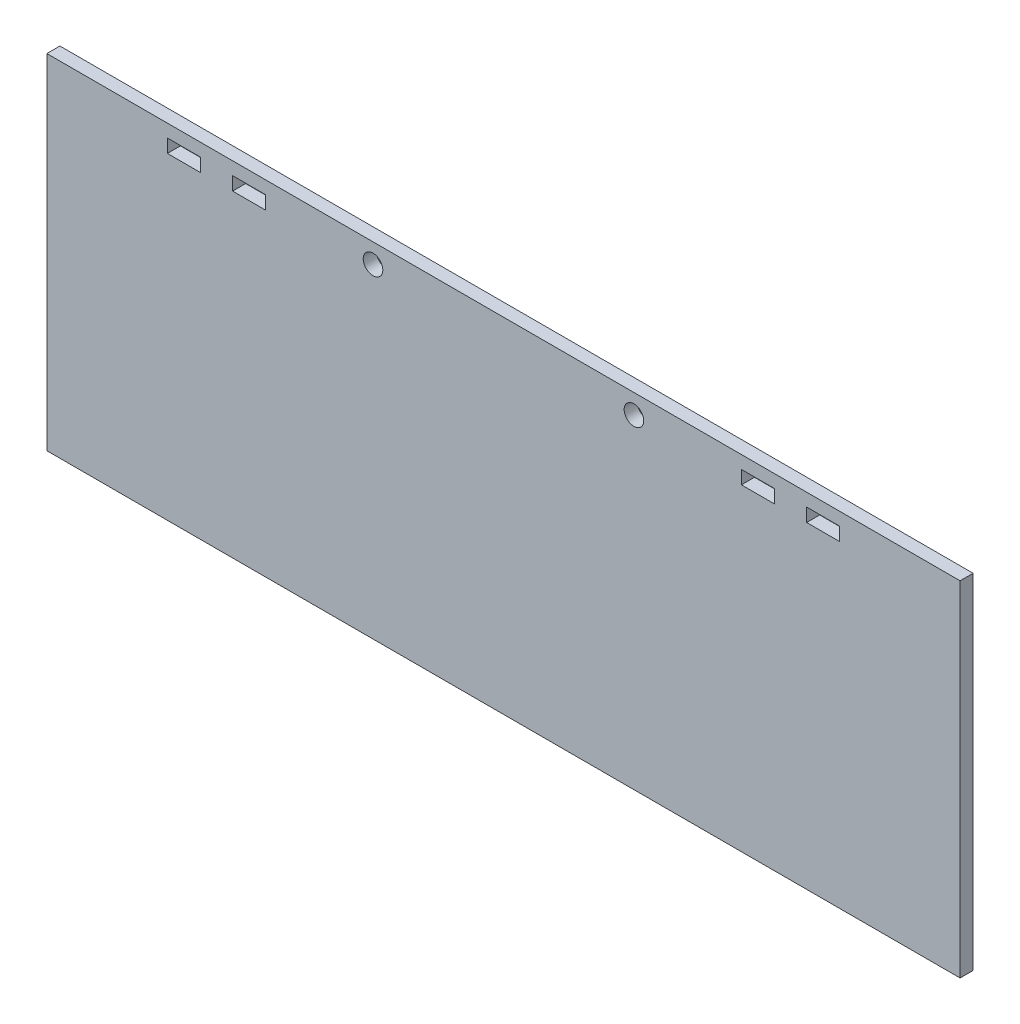
ISO-10303-21;
HEADER;
FILE_DESCRIPTION(('STEP AP214'),'2;1');
FILE_NAME('part.step','',(''),(''),'','','');
FILE_SCHEMA(('AUTOMOTIVE_DESIGN { 1 0 10303 214 1 1 1 1 }'));
ENDSEC;
DATA;
#1=APPLICATION_CONTEXT('core data for automotive mechanical design processes');
#2=APPLICATION_PROTOCOL_DEFINITION('international standard','automotive_design',2000,#1);
#3=PRODUCT_CONTEXT('',#1,'mechanical');
#4=PRODUCT('Part','Part','',(#3));
#5=PRODUCT_RELATED_PRODUCT_CATEGORY('part','',(#4));
#6=PRODUCT_DEFINITION_FORMATION('','',#4);
#7=PRODUCT_DEFINITION_CONTEXT('part definition',#1,'design');
#8=PRODUCT_DEFINITION('design','',#6,#7);
#9=PRODUCT_DEFINITION_SHAPE('','',#8);
#10=(LENGTH_UNIT() NAMED_UNIT(*) SI_UNIT(.MILLI.,.METRE.));
#11=(NAMED_UNIT(*) PLANE_ANGLE_UNIT() SI_UNIT($,.RADIAN.));
#12=(NAMED_UNIT(*) SI_UNIT($,.STERADIAN.) SOLID_ANGLE_UNIT());
#13=UNCERTAINTY_MEASURE_WITH_UNIT(LENGTH_MEASURE(1.E-05),#10,'distance_accuracy_value','');
#14=(GEOMETRIC_REPRESENTATION_CONTEXT(3) GLOBAL_UNCERTAINTY_ASSIGNED_CONTEXT((#13)) GLOBAL_UNIT_ASSIGNED_CONTEXT((#10,
#11,#12)) REPRESENTATION_CONTEXT('',''));
#15=CARTESIAN_POINT('',(0.,0.,0.));
#16=DIRECTION('',(0.,0.,1.));
#17=DIRECTION('',(1.,0.,0.));
#18=AXIS2_PLACEMENT_3D('',#15,#16,#17);
#19=CARTESIAN_POINT('',(0.,0.,2.));
#20=DIRECTION('',(0.,0.,-1.));
#21=DIRECTION('',(-1.,0.,0.));
#22=AXIS2_PLACEMENT_3D('',#19,#20,#21);
#23=PLANE('',#22);
#24=CARTESIAN_POINT('',(34.275,-1.02499999999999,2.));
#25=DIRECTION('',(0.,0.,1.));
#26=DIRECTION('',(1.,0.,0.));
#27=AXIS2_PLACEMENT_3D('',#24,#25,#26);
#28=CIRCLE('',#27,1.5);
#29=CARTESIAN_POINT('',(35.775,-1.02499999999999,2.));
#30=VERTEX_POINT('',#29);
#31=EDGE_CURVE('E228',#30,#30,#28,.T.);
#32=ORIENTED_EDGE('',*,*,#31,.F.);
#33=EDGE_LOOP('',(#32));
#34=FACE_BOUND('',#33,.T.);
#35=DIRECTION('',(0.,1.,0.));
#36=VECTOR('',#35,1.);
#37=CARTESIAN_POINT('',(105.8,0.,2.));
#38=LINE('',#37,#36);
#39=CARTESIAN_POINT('',(105.8,-2.04999999999999,2.));
#40=VERTEX_POINT('',#39);
#41=CARTESIAN_POINT('',(105.8,0.,2.));
#42=VERTEX_POINT('',#41);
#43=EDGE_CURVE('E236',#40,#42,#38,.T.);
#44=ORIENTED_EDGE('',*,*,#43,.F.);
#45=DIRECTION('',(1.,0.,0.));
#46=VECTOR('',#45,1.);
#47=CARTESIAN_POINT('',(105.8,-2.04999999999999,2.));
#48=LINE('',#47,#46);
#49=CARTESIAN_POINT('',(100.75,-2.04999999999999,2.));
#50=VERTEX_POINT('',#49);
#51=EDGE_CURVE('E247',#50,#40,#48,.T.);
#52=ORIENTED_EDGE('',*,*,#51,.F.);
#53=DIRECTION('',(0.,-1.,0.));
#54=VECTOR('',#53,1.);
#55=CARTESIAN_POINT('',(100.75,0.,2.));
#56=LINE('',#55,#54);
#57=CARTESIAN_POINT('',(100.75,0.,2.));
#58=VERTEX_POINT('',#57);
#59=EDGE_CURVE('E243',#58,#50,#56,.T.);
#60=ORIENTED_EDGE('',*,*,#59,.F.);
#61=DIRECTION('',(-1.,0.,0.));
#62=VECTOR('',#61,1.);
#63=CARTESIAN_POINT('',(105.8,0.,2.));
#64=LINE('',#63,#62);
#65=EDGE_CURVE('E239',#42,#58,#64,.T.);
#66=ORIENTED_EDGE('',*,*,#65,.F.);
#67=EDGE_LOOP('',(#44,#52,#60,#66));
#68=FACE_BOUND('',#67,.T.);
#69=DIRECTION('',(0.,1.,0.));
#70=VECTOR('',#69,1.);
#71=CARTESIAN_POINT('',(7.80000000000001,0.,2.));
#72=LINE('',#71,#70);
#73=CARTESIAN_POINT('',(7.80000000000001,-2.04999999999999,2.));
#74=VERTEX_POINT('',#73);
#75=CARTESIAN_POINT('',(7.80000000000001,0.,2.));
#76=VERTEX_POINT('',#75);
#77=EDGE_CURVE('E322',#74,#76,#72,.T.);
#78=ORIENTED_EDGE('',*,*,#77,.F.);
#79=DIRECTION('',(1.,0.,0.));
#80=VECTOR('',#79,1.);
#81=CARTESIAN_POINT('',(2.75000000000001,-2.04999999999999,2.));
#82=LINE('',#81,#80);
#83=CARTESIAN_POINT('',(2.75000000000001,-2.04999999999999,2.));
#84=VERTEX_POINT('',#83);
#85=EDGE_CURVE('E333',#84,#74,#82,.T.);
#86=ORIENTED_EDGE('',*,*,#85,.F.);
#87=DIRECTION('',(0.,-1.,0.));
#88=VECTOR('',#87,1.);
#89=CARTESIAN_POINT('',(2.75000000000001,0.,2.));
#90=LINE('',#89,#88);
#91=CARTESIAN_POINT('',(2.75000000000001,0.,2.));
#92=VERTEX_POINT('',#91);
#93=EDGE_CURVE('E329',#92,#84,#90,.T.);
#94=ORIENTED_EDGE('',*,*,#93,.F.);
#95=DIRECTION('',(-1.,0.,0.));
#96=VECTOR('',#95,1.);
#97=CARTESIAN_POINT('',(2.75000000000001,0.,2.));
#98=LINE('',#97,#96);
#99=EDGE_CURVE('E325',#76,#92,#98,.T.);
#100=ORIENTED_EDGE('',*,*,#99,.F.);
#101=EDGE_LOOP('',(#78,#86,#94,#100));
#102=FACE_BOUND('',#101,.T.);
#103=DIRECTION('',(-1.,0.,0.));
#104=VECTOR('',#103,1.);
#105=CARTESIAN_POINT('',(54.275,1.97500000000001,2.));
#106=LINE('',#105,#104);
#107=CARTESIAN_POINT('',(124.275,1.97500000000001,2.));
#108=VERTEX_POINT('',#107);
#109=CARTESIAN_POINT('',(-15.725,1.975,2.));
#110=VERTEX_POINT('',#109);
#111=EDGE_CURVE('E365',#108,#110,#106,.T.);
#112=ORIENTED_EDGE('',*,*,#111,.T.);
#113=DIRECTION('',(0.,-1.,0.));
#114=VECTOR('',#113,1.);
#115=CARTESIAN_POINT('',(-15.725,-50.7609146083273,2.));
#116=LINE('',#115,#114);
#117=CARTESIAN_POINT('',(-15.725,-50.7609146083273,2.));
#118=VERTEX_POINT('',#117);
#119=EDGE_CURVE('E368',#110,#118,#116,.T.);
#120=ORIENTED_EDGE('',*,*,#119,.T.);
#121=DIRECTION('',(1.,0.,0.));
#122=VECTOR('',#121,1.);
#123=CARTESIAN_POINT('',(124.275,-50.7609146083273,2.));
#124=LINE('',#123,#122);
#125=CARTESIAN_POINT('',(124.275,-50.7609146083273,2.));
#126=VERTEX_POINT('',#125);
#127=EDGE_CURVE('E372',#118,#126,#124,.T.);
#128=ORIENTED_EDGE('',*,*,#127,.T.);
#129=DIRECTION('',(0.,1.,0.));
#130=VECTOR('',#129,1.);
#131=CARTESIAN_POINT('',(124.275,1.97500000000001,2.));
#132=LINE('',#131,#130);
#133=EDGE_CURVE('E375',#126,#108,#132,.T.);
#134=ORIENTED_EDGE('',*,*,#133,.T.);
#135=EDGE_LOOP('',(#112,#120,#128,#134));
#136=FACE_BOUND('',#135,.T.);
#137=DIRECTION('',(0.,1.,0.));
#138=VECTOR('',#137,1.);
#139=CARTESIAN_POINT('',(17.8,0.,2.));
#140=LINE('',#139,#138);
#141=CARTESIAN_POINT('',(17.8,-2.04999999999999,2.));
#142=VERTEX_POINT('',#141);
#143=CARTESIAN_POINT('',(17.8,0.,2.));
#144=VERTEX_POINT('',#143);
#145=EDGE_CURVE('E279',#142,#144,#140,.T.);
#146=ORIENTED_EDGE('',*,*,#145,.F.);
#147=DIRECTION('',(1.,0.,0.));
#148=VECTOR('',#147,1.);
#149=CARTESIAN_POINT('',(12.75,-2.04999999999999,2.));
#150=LINE('',#149,#148);
#151=CARTESIAN_POINT('',(12.75,-2.04999999999999,2.));
#152=VERTEX_POINT('',#151);
#153=EDGE_CURVE('E290',#152,#142,#150,.T.);
#154=ORIENTED_EDGE('',*,*,#153,.F.);
#155=DIRECTION('',(0.,-1.,0.));
#156=VECTOR('',#155,1.);
#157=CARTESIAN_POINT('',(12.75,0.,2.));
#158=LINE('',#157,#156);
#159=CARTESIAN_POINT('',(12.75,0.,2.));
#160=VERTEX_POINT('',#159);
#161=EDGE_CURVE('E286',#160,#152,#158,.T.);
#162=ORIENTED_EDGE('',*,*,#161,.F.);
#163=DIRECTION('',(-1.,0.,0.));
#164=VECTOR('',#163,1.);
#165=CARTESIAN_POINT('',(12.75,0.,2.));
#166=LINE('',#165,#164);
#167=EDGE_CURVE('E282',#144,#160,#166,.T.);
#168=ORIENTED_EDGE('',*,*,#167,.F.);
#169=EDGE_LOOP('',(#146,#154,#162,#168));
#170=FACE_BOUND('',#169,.T.);
#171=DIRECTION('',(0.,1.,0.));
#172=VECTOR('',#171,1.);
#173=CARTESIAN_POINT('',(95.8,0.,2.));
#174=LINE('',#173,#172);
#175=CARTESIAN_POINT('',(95.8,-2.04999999999999,2.));
#176=VERTEX_POINT('',#175);
#177=CARTESIAN_POINT('',(95.8,0.,2.));
#178=VERTEX_POINT('',#177);
#179=EDGE_CURVE('E177',#176,#178,#174,.T.);
#180=ORIENTED_EDGE('',*,*,#179,.F.);
#181=DIRECTION('',(1.,0.,0.));
#182=VECTOR('',#181,1.);
#183=CARTESIAN_POINT('',(95.8,-2.04999999999999,2.));
#184=LINE('',#183,#182);
#185=CARTESIAN_POINT('',(90.75,-2.04999999999999,2.));
#186=VERTEX_POINT('',#185);
#187=EDGE_CURVE('E204',#186,#176,#184,.T.);
#188=ORIENTED_EDGE('',*,*,#187,.F.);
#189=DIRECTION('',(0.,-1.,0.));
#190=VECTOR('',#189,1.);
#191=CARTESIAN_POINT('',(90.75,0.,2.));
#192=LINE('',#191,#190);
#193=CARTESIAN_POINT('',(90.75,0.,2.));
#194=VERTEX_POINT('',#193);
#195=EDGE_CURVE('E200',#194,#186,#192,.T.);
#196=ORIENTED_EDGE('',*,*,#195,.F.);
#197=DIRECTION('',(-1.,0.,0.));
#198=VECTOR('',#197,1.);
#199=CARTESIAN_POINT('',(95.8,0.,2.));
#200=LINE('',#199,#198);
#201=EDGE_CURVE('E186',#178,#194,#200,.T.);
#202=ORIENTED_EDGE('',*,*,#201,.F.);
#203=EDGE_LOOP('',(#180,#188,#196,#202));
#204=FACE_BOUND('',#203,.T.);
#205=CARTESIAN_POINT('',(74.275,-1.02499999999999,2.));
#206=DIRECTION('',(0.,0.,1.));
#207=DIRECTION('',(1.,0.,0.));
#208=AXIS2_PLACEMENT_3D('',#205,#206,#207);
#209=CIRCLE('',#208,1.5);
#210=CARTESIAN_POINT('',(75.775,-1.02499999999999,2.));
#211=VERTEX_POINT('',#210);
#212=EDGE_CURVE('E212',#211,#211,#209,.T.);
#213=ORIENTED_EDGE('',*,*,#212,.F.);
#214=EDGE_LOOP('',(#213));
#215=FACE_BOUND('',#214,.T.);
#216=ADVANCED_FACE('F39',(#34,#68,#102,#136,#170,#204,#215),#23,.F.);
#217=CARTESIAN_POINT('',(0.,0.,0.));
#218=DIRECTION('',(0.,0.,-1.));
#219=DIRECTION('',(-1.,0.,0.));
#220=AXIS2_PLACEMENT_3D('',#217,#218,#219);
#221=PLANE('',#220);
#222=DIRECTION('',(1.,0.,0.));
#223=VECTOR('',#222,1.);
#224=CARTESIAN_POINT('',(95.8,-2.04999999999999,0.));
#225=LINE('',#224,#223);
#226=CARTESIAN_POINT('',(90.75,-2.04999999999999,0.));
#227=VERTEX_POINT('',#226);
#228=CARTESIAN_POINT('',(95.8,-2.04999999999999,0.));
#229=VERTEX_POINT('',#228);
#230=EDGE_CURVE('E187',#227,#229,#225,.T.);
#231=ORIENTED_EDGE('',*,*,#230,.T.);
#232=DIRECTION('',(0.,1.,0.));
#233=VECTOR('',#232,1.);
#234=CARTESIAN_POINT('',(95.8,0.,0.));
#235=LINE('',#234,#233);
#236=CARTESIAN_POINT('',(95.8,0.,0.));
#237=VERTEX_POINT('',#236);
#238=EDGE_CURVE('E63',#229,#237,#235,.T.);
#239=ORIENTED_EDGE('',*,*,#238,.T.);
#240=DIRECTION('',(-1.,0.,0.));
#241=VECTOR('',#240,1.);
#242=CARTESIAN_POINT('',(95.8,0.,0.));
#243=LINE('',#242,#241);
#244=CARTESIAN_POINT('',(90.75,0.,0.));
#245=VERTEX_POINT('',#244);
#246=EDGE_CURVE('E193',#237,#245,#243,.T.);
#247=ORIENTED_EDGE('',*,*,#246,.T.);
#248=DIRECTION('',(0.,-1.,0.));
#249=VECTOR('',#248,1.);
#250=CARTESIAN_POINT('',(90.75,0.,0.));
#251=LINE('',#250,#249);
#252=EDGE_CURVE('E215',#245,#227,#251,.T.);
#253=ORIENTED_EDGE('',*,*,#252,.T.);
#254=EDGE_LOOP('',(#231,#239,#247,#253));
#255=FACE_BOUND('',#254,.T.);
#256=CARTESIAN_POINT('',(34.275,-1.02499999999999,0.));
#257=DIRECTION('',(0.,0.,1.));
#258=DIRECTION('',(1.,0.,0.));
#259=AXIS2_PLACEMENT_3D('',#256,#257,#258);
#260=CIRCLE('',#259,1.5);
#261=CARTESIAN_POINT('',(35.775,-1.02499999999999,0.));
#262=VERTEX_POINT('',#261);
#263=EDGE_CURVE('E195',#262,#262,#260,.T.);
#264=ORIENTED_EDGE('',*,*,#263,.T.);
#265=EDGE_LOOP('',(#264));
#266=FACE_BOUND('',#265,.T.);
#267=DIRECTION('',(-1.,0.,0.));
#268=VECTOR('',#267,1.);
#269=CARTESIAN_POINT('',(54.275,1.97500000000001,0.));
#270=LINE('',#269,#268);
#271=CARTESIAN_POINT('',(124.275,1.97500000000001,0.));
#272=VERTEX_POINT('',#271);
#273=CARTESIAN_POINT('',(-15.725,1.975,0.));
#274=VERTEX_POINT('',#273);
#275=EDGE_CURVE('E364',#272,#274,#270,.T.);
#276=ORIENTED_EDGE('',*,*,#275,.F.);
#277=DIRECTION('',(0.,1.,0.));
#278=VECTOR('',#277,1.);
#279=CARTESIAN_POINT('',(124.275,1.97500000000001,0.));
#280=LINE('',#279,#278);
#281=CARTESIAN_POINT('',(124.275,-50.7609146083273,0.));
#282=VERTEX_POINT('',#281);
#283=EDGE_CURVE('E369',#282,#272,#280,.T.);
#284=ORIENTED_EDGE('',*,*,#283,.F.);
#285=DIRECTION('',(1.,0.,0.));
#286=VECTOR('',#285,1.);
#287=CARTESIAN_POINT('',(124.275,-50.7609146083273,0.));
#288=LINE('',#287,#286);
#289=CARTESIAN_POINT('',(-15.725,-50.7609146083273,0.));
#290=VERTEX_POINT('',#289);
#291=EDGE_CURVE('E384',#290,#282,#288,.T.);
#292=ORIENTED_EDGE('',*,*,#291,.F.);
#293=DIRECTION('',(0.,-1.,0.));
#294=VECTOR('',#293,1.);
#295=CARTESIAN_POINT('',(-15.725,-50.7609146083273,0.));
#296=LINE('',#295,#294);
#297=EDGE_CURVE('E381',#274,#290,#296,.T.);
#298=ORIENTED_EDGE('',*,*,#297,.F.);
#299=EDGE_LOOP('',(#276,#284,#292,#298));
#300=FACE_BOUND('',#299,.T.);
#301=DIRECTION('',(1.,0.,0.));
#302=VECTOR('',#301,1.);
#303=CARTESIAN_POINT('',(2.75000000000001,-2.04999999999999,0.));
#304=LINE('',#303,#302);
#305=CARTESIAN_POINT('',(2.75000000000001,-2.04999999999999,0.));
#306=VERTEX_POINT('',#305);
#307=CARTESIAN_POINT('',(7.80000000000001,-2.04999999999999,0.));
#308=VERTEX_POINT('',#307);
#309=EDGE_CURVE('E326',#306,#308,#304,.T.);
#310=ORIENTED_EDGE('',*,*,#309,.T.);
#311=DIRECTION('',(0.,1.,0.));
#312=VECTOR('',#311,1.);
#313=CARTESIAN_POINT('',(7.80000000000001,0.,0.));
#314=LINE('',#313,#312);
#315=CARTESIAN_POINT('',(7.80000000000001,0.,0.));
#316=VERTEX_POINT('',#315);
#317=EDGE_CURVE('E321',#308,#316,#314,.T.);
#318=ORIENTED_EDGE('',*,*,#317,.T.);
#319=DIRECTION('',(-1.,0.,0.));
#320=VECTOR('',#319,1.);
#321=CARTESIAN_POINT('',(2.75000000000001,0.,0.));
#322=LINE('',#321,#320);
#323=CARTESIAN_POINT('',(2.75000000000001,0.,0.));
#324=VERTEX_POINT('',#323);
#325=EDGE_CURVE('E340',#316,#324,#322,.T.);
#326=ORIENTED_EDGE('',*,*,#325,.T.);
#327=DIRECTION('',(0.,-1.,0.));
#328=VECTOR('',#327,1.);
#329=CARTESIAN_POINT('',(2.75000000000001,0.,0.));
#330=LINE('',#329,#328);
#331=EDGE_CURVE('E344',#324,#306,#330,.T.);
#332=ORIENTED_EDGE('',*,*,#331,.T.);
#333=EDGE_LOOP('',(#310,#318,#326,#332));
#334=FACE_BOUND('',#333,.T.);
#335=DIRECTION('',(1.,0.,0.));
#336=VECTOR('',#335,1.);
#337=CARTESIAN_POINT('',(12.75,-2.04999999999999,0.));
#338=LINE('',#337,#336);
#339=CARTESIAN_POINT('',(12.75,-2.04999999999999,0.));
#340=VERTEX_POINT('',#339);
#341=CARTESIAN_POINT('',(17.8,-2.04999999999999,0.));
#342=VERTEX_POINT('',#341);
#343=EDGE_CURVE('E283',#340,#342,#338,.T.);
#344=ORIENTED_EDGE('',*,*,#343,.T.);
#345=DIRECTION('',(0.,1.,0.));
#346=VECTOR('',#345,1.);
#347=CARTESIAN_POINT('',(17.8,0.,0.));
#348=LINE('',#347,#346);
#349=CARTESIAN_POINT('',(17.8,0.,0.));
#350=VERTEX_POINT('',#349);
#351=EDGE_CURVE('E278',#342,#350,#348,.T.);
#352=ORIENTED_EDGE('',*,*,#351,.T.);
#353=DIRECTION('',(-1.,0.,0.));
#354=VECTOR('',#353,1.);
#355=CARTESIAN_POINT('',(12.75,0.,0.));
#356=LINE('',#355,#354);
#357=CARTESIAN_POINT('',(12.75,0.,0.));
#358=VERTEX_POINT('',#357);
#359=EDGE_CURVE('E297',#350,#358,#356,.T.);
#360=ORIENTED_EDGE('',*,*,#359,.T.);
#361=DIRECTION('',(0.,-1.,0.));
#362=VECTOR('',#361,1.);
#363=CARTESIAN_POINT('',(12.75,0.,0.));
#364=LINE('',#363,#362);
#365=EDGE_CURVE('E301',#358,#340,#364,.T.);
#366=ORIENTED_EDGE('',*,*,#365,.T.);
#367=EDGE_LOOP('',(#344,#352,#360,#366));
#368=FACE_BOUND('',#367,.T.);
#369=DIRECTION('',(1.,0.,0.));
#370=VECTOR('',#369,1.);
#371=CARTESIAN_POINT('',(105.8,-2.04999999999999,0.));
#372=LINE('',#371,#370);
#373=CARTESIAN_POINT('',(100.75,-2.04999999999999,0.));
#374=VERTEX_POINT('',#373);
#375=CARTESIAN_POINT('',(105.8,-2.04999999999999,0.));
#376=VERTEX_POINT('',#375);
#377=EDGE_CURVE('E240',#374,#376,#372,.T.);
#378=ORIENTED_EDGE('',*,*,#377,.T.);
#379=DIRECTION('',(0.,1.,0.));
#380=VECTOR('',#379,1.);
#381=CARTESIAN_POINT('',(105.8,0.,0.));
#382=LINE('',#381,#380);
#383=CARTESIAN_POINT('',(105.8,0.,0.));
#384=VERTEX_POINT('',#383);
#385=EDGE_CURVE('E232',#376,#384,#382,.T.);
#386=ORIENTED_EDGE('',*,*,#385,.T.);
#387=DIRECTION('',(-1.,0.,0.));
#388=VECTOR('',#387,1.);
#389=CARTESIAN_POINT('',(105.8,0.,0.));
#390=LINE('',#389,#388);
#391=CARTESIAN_POINT('',(100.75,0.,0.));
#392=VERTEX_POINT('',#391);
#393=EDGE_CURVE('E254',#384,#392,#390,.T.);
#394=ORIENTED_EDGE('',*,*,#393,.T.);
#395=DIRECTION('',(0.,-1.,0.));
#396=VECTOR('',#395,1.);
#397=CARTESIAN_POINT('',(100.75,0.,0.));
#398=LINE('',#397,#396);
#399=EDGE_CURVE('E258',#392,#374,#398,.T.);
#400=ORIENTED_EDGE('',*,*,#399,.T.);
#401=EDGE_LOOP('',(#378,#386,#394,#400));
#402=FACE_BOUND('',#401,.T.);
#403=CARTESIAN_POINT('',(74.275,-1.02499999999999,0.));
#404=DIRECTION('',(0.,0.,1.));
#405=DIRECTION('',(1.,0.,0.));
#406=AXIS2_PLACEMENT_3D('',#403,#404,#405);
#407=CIRCLE('',#406,1.5);
#408=CARTESIAN_POINT('',(75.775,-1.02499999999999,0.));
#409=VERTEX_POINT('',#408);
#410=EDGE_CURVE('E530',#409,#409,#407,.T.);
#411=ORIENTED_EDGE('',*,*,#410,.T.);
#412=EDGE_LOOP('',(#411));
#413=FACE_BOUND('',#412,.T.);
#414=ADVANCED_FACE('F409',(#255,#266,#300,#334,#368,#402,#413),#221,.T.);
#415=CARTESIAN_POINT('',(54.275,1.97500000000001,2.));
#416=DIRECTION('',(0.,-1.,0.));
#417=DIRECTION('',(1.,0.,0.));
#418=AXIS2_PLACEMENT_3D('',#415,#416,#417);
#419=PLANE('',#418);
#420=ORIENTED_EDGE('',*,*,#275,.T.);
#421=DIRECTION('',(0.,0.,-1.));
#422=VECTOR('',#421,1.);
#423=CARTESIAN_POINT('',(-15.725,1.975,2.));
#424=LINE('',#423,#422);
#425=EDGE_CURVE('E11',#110,#274,#424,.T.);
#426=ORIENTED_EDGE('',*,*,#425,.F.);
#427=ORIENTED_EDGE('',*,*,#111,.F.);
#428=DIRECTION('',(0.,0.,-1.));
#429=VECTOR('',#428,1.);
#430=CARTESIAN_POINT('',(124.275,1.97500000000001,2.));
#431=LINE('',#430,#429);
#432=EDGE_CURVE('E378',#108,#272,#431,.T.);
#433=ORIENTED_EDGE('',*,*,#432,.T.);
#434=EDGE_LOOP('',(#420,#426,#427,#433));
#435=FACE_BOUND('',#434,.T.);
#436=ADVANCED_FACE('F41',(#435),#419,.F.);
#437=CARTESIAN_POINT('',(-15.725,-50.7609146083273,2.));
#438=DIRECTION('',(1.,0.,0.));
#439=DIRECTION('',(0.,0.,-1.));
#440=AXIS2_PLACEMENT_3D('',#437,#438,#439);
#441=PLANE('',#440);
#442=ORIENTED_EDGE('',*,*,#297,.T.);
#443=DIRECTION('',(0.,0.,-1.));
#444=VECTOR('',#443,1.);
#445=CARTESIAN_POINT('',(-15.725,-50.7609146083273,2.));
#446=LINE('',#445,#444);
#447=EDGE_CURVE('E48',#118,#290,#446,.T.);
#448=ORIENTED_EDGE('',*,*,#447,.F.);
#449=ORIENTED_EDGE('',*,*,#119,.F.);
#450=ORIENTED_EDGE('',*,*,#425,.T.);
#451=EDGE_LOOP('',(#442,#448,#449,#450));
#452=FACE_BOUND('',#451,.T.);
#453=ADVANCED_FACE('F420',(#452),#441,.F.);
#454=CARTESIAN_POINT('',(124.275,-50.7609146083273,2.));
#455=DIRECTION('',(0.,1.,0.));
#456=DIRECTION('',(-1.,0.,0.));
#457=AXIS2_PLACEMENT_3D('',#454,#455,#456);
#458=PLANE('',#457);
#459=ORIENTED_EDGE('',*,*,#291,.T.);
#460=DIRECTION('',(0.,0.,-1.));
#461=VECTOR('',#460,1.);
#462=CARTESIAN_POINT('',(124.275,-50.7609146083273,2.));
#463=LINE('',#462,#461);
#464=EDGE_CURVE('E393',#126,#282,#463,.T.);
#465=ORIENTED_EDGE('',*,*,#464,.F.);
#466=ORIENTED_EDGE('',*,*,#127,.F.);
#467=ORIENTED_EDGE('',*,*,#447,.T.);
#468=EDGE_LOOP('',(#459,#465,#466,#467));
#469=FACE_BOUND('',#468,.T.);
#470=ADVANCED_FACE('F402',(#469),#458,.F.);
#471=CARTESIAN_POINT('',(124.275,1.97500000000001,2.));
#472=DIRECTION('',(-1.,0.,0.));
#473=DIRECTION('',(0.,0.,1.));
#474=AXIS2_PLACEMENT_3D('',#471,#472,#473);
#475=PLANE('',#474);
#476=ORIENTED_EDGE('',*,*,#283,.T.);
#477=ORIENTED_EDGE('',*,*,#432,.F.);
#478=ORIENTED_EDGE('',*,*,#133,.F.);
#479=ORIENTED_EDGE('',*,*,#464,.T.);
#480=EDGE_LOOP('',(#476,#477,#478,#479));
#481=FACE_BOUND('',#480,.T.);
#482=ADVANCED_FACE('F413',(#481),#475,.F.);
#483=CARTESIAN_POINT('',(7.80000000000001,0.,2.));
#484=DIRECTION('',(-1.,0.,0.));
#485=DIRECTION('',(0.,0.,1.));
#486=AXIS2_PLACEMENT_3D('',#483,#484,#485);
#487=PLANE('',#486);
#488=ORIENTED_EDGE('',*,*,#317,.F.);
#489=DIRECTION('',(0.,0.,-1.));
#490=VECTOR('',#489,1.);
#491=CARTESIAN_POINT('',(7.80000000000001,-2.04999999999999,2.));
#492=LINE('',#491,#490);
#493=EDGE_CURVE('E336',#74,#308,#492,.T.);
#494=ORIENTED_EDGE('',*,*,#493,.F.);
#495=ORIENTED_EDGE('',*,*,#77,.T.);
#496=DIRECTION('',(0.,0.,-1.));
#497=VECTOR('',#496,1.);
#498=CARTESIAN_POINT('',(7.80000000000001,0.,2.));
#499=LINE('',#498,#497);
#500=EDGE_CURVE('E360',#76,#316,#499,.T.);
#501=ORIENTED_EDGE('',*,*,#500,.T.);
#502=EDGE_LOOP('',(#488,#494,#495,#501));
#503=FACE_BOUND('',#502,.T.);
#504=ADVANCED_FACE('F438',(#503),#487,.T.);
#505=CARTESIAN_POINT('',(2.75000000000001,0.,2.));
#506=DIRECTION('',(0.,-1.,0.));
#507=DIRECTION('',(0.,0.,-1.));
#508=AXIS2_PLACEMENT_3D('',#505,#506,#507);
#509=PLANE('',#508);
#510=ORIENTED_EDGE('',*,*,#325,.F.);
#511=ORIENTED_EDGE('',*,*,#500,.F.);
#512=ORIENTED_EDGE('',*,*,#99,.T.);
#513=DIRECTION('',(0.,0.,-1.));
#514=VECTOR('',#513,1.);
#515=CARTESIAN_POINT('',(2.75000000000001,0.,2.));
#516=LINE('',#515,#514);
#517=EDGE_CURVE('E357',#92,#324,#516,.T.);
#518=ORIENTED_EDGE('',*,*,#517,.T.);
#519=EDGE_LOOP('',(#510,#511,#512,#518));
#520=FACE_BOUND('',#519,.T.);
#521=ADVANCED_FACE('F445',(#520),#509,.T.);
#522=CARTESIAN_POINT('',(2.75000000000001,0.,2.));
#523=DIRECTION('',(1.,0.,0.));
#524=DIRECTION('',(0.,1.,0.));
#525=AXIS2_PLACEMENT_3D('',#522,#523,#524);
#526=PLANE('',#525);
#527=ORIENTED_EDGE('',*,*,#331,.F.);
#528=ORIENTED_EDGE('',*,*,#517,.F.);
#529=ORIENTED_EDGE('',*,*,#93,.T.);
#530=DIRECTION('',(0.,0.,-1.));
#531=VECTOR('',#530,1.);
#532=CARTESIAN_POINT('',(2.75000000000001,-2.04999999999999,2.));
#533=LINE('',#532,#531);
#534=EDGE_CURVE('E354',#84,#306,#533,.T.);
#535=ORIENTED_EDGE('',*,*,#534,.T.);
#536=EDGE_LOOP('',(#527,#528,#529,#535));
#537=FACE_BOUND('',#536,.T.);
#538=ADVANCED_FACE('F450',(#537),#526,.T.);
#539=CARTESIAN_POINT('',(2.75000000000001,-2.04999999999999,2.));
#540=DIRECTION('',(0.,1.,0.));
#541=DIRECTION('',(-1.,0.,0.));
#542=AXIS2_PLACEMENT_3D('',#539,#540,#541);
#543=PLANE('',#542);
#544=ORIENTED_EDGE('',*,*,#309,.F.);
#545=ORIENTED_EDGE('',*,*,#534,.F.);
#546=ORIENTED_EDGE('',*,*,#85,.T.);
#547=ORIENTED_EDGE('',*,*,#493,.T.);
#548=EDGE_LOOP('',(#544,#545,#546,#547));
#549=FACE_BOUND('',#548,.T.);
#550=ADVANCED_FACE('F457',(#549),#543,.T.);
#551=CARTESIAN_POINT('',(17.8,0.,2.));
#552=DIRECTION('',(-1.,0.,0.));
#553=DIRECTION('',(0.,0.,1.));
#554=AXIS2_PLACEMENT_3D('',#551,#552,#553);
#555=PLANE('',#554);
#556=ORIENTED_EDGE('',*,*,#351,.F.);
#557=DIRECTION('',(0.,0.,-1.));
#558=VECTOR('',#557,1.);
#559=CARTESIAN_POINT('',(17.8,-2.04999999999999,2.));
#560=LINE('',#559,#558);
#561=EDGE_CURVE('E293',#142,#342,#560,.T.);
#562=ORIENTED_EDGE('',*,*,#561,.F.);
#563=ORIENTED_EDGE('',*,*,#145,.T.);
#564=DIRECTION('',(0.,0.,-1.));
#565=VECTOR('',#564,1.);
#566=CARTESIAN_POINT('',(17.8,0.,2.));
#567=LINE('',#566,#565);
#568=EDGE_CURVE('E317',#144,#350,#567,.T.);
#569=ORIENTED_EDGE('',*,*,#568,.T.);
#570=EDGE_LOOP('',(#556,#562,#563,#569));
#571=FACE_BOUND('',#570,.T.);
#572=ADVANCED_FACE('F471',(#571),#555,.T.);
#573=CARTESIAN_POINT('',(12.75,0.,2.));
#574=DIRECTION('',(0.,-1.,0.));
#575=DIRECTION('',(0.,0.,-1.));
#576=AXIS2_PLACEMENT_3D('',#573,#574,#575);
#577=PLANE('',#576);
#578=ORIENTED_EDGE('',*,*,#359,.F.);
#579=ORIENTED_EDGE('',*,*,#568,.F.);
#580=ORIENTED_EDGE('',*,*,#167,.T.);
#581=DIRECTION('',(0.,0.,-1.));
#582=VECTOR('',#581,1.);
#583=CARTESIAN_POINT('',(12.75,0.,2.));
#584=LINE('',#583,#582);
#585=EDGE_CURVE('E314',#160,#358,#584,.T.);
#586=ORIENTED_EDGE('',*,*,#585,.T.);
#587=EDGE_LOOP('',(#578,#579,#580,#586));
#588=FACE_BOUND('',#587,.T.);
#589=ADVANCED_FACE('F476',(#588),#577,.T.);
#590=CARTESIAN_POINT('',(12.75,0.,2.));
#591=DIRECTION('',(1.,0.,0.));
#592=DIRECTION('',(0.,0.,-1.));
#593=AXIS2_PLACEMENT_3D('',#590,#591,#592);
#594=PLANE('',#593);
#595=ORIENTED_EDGE('',*,*,#365,.F.);
#596=ORIENTED_EDGE('',*,*,#585,.F.);
#597=ORIENTED_EDGE('',*,*,#161,.T.);
#598=DIRECTION('',(0.,0.,-1.));
#599=VECTOR('',#598,1.);
#600=CARTESIAN_POINT('',(12.75,-2.04999999999999,2.));
#601=LINE('',#600,#599);
#602=EDGE_CURVE('E311',#152,#340,#601,.T.);
#603=ORIENTED_EDGE('',*,*,#602,.T.);
#604=EDGE_LOOP('',(#595,#596,#597,#603));
#605=FACE_BOUND('',#604,.T.);
#606=ADVANCED_FACE('F480',(#605),#594,.T.);
#607=CARTESIAN_POINT('',(12.75,-2.04999999999999,2.));
#608=DIRECTION('',(0.,1.,0.));
#609=DIRECTION('',(0.,0.,1.));
#610=AXIS2_PLACEMENT_3D('',#607,#608,#609);
#611=PLANE('',#610);
#612=ORIENTED_EDGE('',*,*,#343,.F.);
#613=ORIENTED_EDGE('',*,*,#602,.F.);
#614=ORIENTED_EDGE('',*,*,#153,.T.);
#615=ORIENTED_EDGE('',*,*,#561,.T.);
#616=EDGE_LOOP('',(#612,#613,#614,#615));
#617=FACE_BOUND('',#616,.T.);
#618=ADVANCED_FACE('F484',(#617),#611,.T.);
#619=CARTESIAN_POINT('',(105.8,0.,2.));
#620=DIRECTION('',(-1.,0.,0.));
#621=DIRECTION('',(0.,0.,1.));
#622=AXIS2_PLACEMENT_3D('',#619,#620,#621);
#623=PLANE('',#622);
#624=ORIENTED_EDGE('',*,*,#385,.F.);
#625=DIRECTION('',(0.,0.,-1.));
#626=VECTOR('',#625,1.);
#627=CARTESIAN_POINT('',(105.8,-2.04999999999999,2.));
#628=LINE('',#627,#626);
#629=EDGE_CURVE('E250',#40,#376,#628,.T.);
#630=ORIENTED_EDGE('',*,*,#629,.F.);
#631=ORIENTED_EDGE('',*,*,#43,.T.);
#632=DIRECTION('',(0.,0.,-1.));
#633=VECTOR('',#632,1.);
#634=CARTESIAN_POINT('',(105.8,0.,2.));
#635=LINE('',#634,#633);
#636=EDGE_CURVE('E274',#42,#384,#635,.T.);
#637=ORIENTED_EDGE('',*,*,#636,.T.);
#638=EDGE_LOOP('',(#624,#630,#631,#637));
#639=FACE_BOUND('',#638,.T.);
#640=ADVANCED_FACE('F488',(#639),#623,.T.);
#641=CARTESIAN_POINT('',(105.8,0.,2.));
#642=DIRECTION('',(0.,-1.,0.));
#643=DIRECTION('',(0.,0.,-1.));
#644=AXIS2_PLACEMENT_3D('',#641,#642,#643);
#645=PLANE('',#644);
#646=ORIENTED_EDGE('',*,*,#393,.F.);
#647=ORIENTED_EDGE('',*,*,#636,.F.);
#648=ORIENTED_EDGE('',*,*,#65,.T.);
#649=DIRECTION('',(0.,0.,-1.));
#650=VECTOR('',#649,1.);
#651=CARTESIAN_POINT('',(100.75,0.,2.));
#652=LINE('',#651,#650);
#653=EDGE_CURVE('E271',#58,#392,#652,.T.);
#654=ORIENTED_EDGE('',*,*,#653,.T.);
#655=EDGE_LOOP('',(#646,#647,#648,#654));
#656=FACE_BOUND('',#655,.T.);
#657=ADVANCED_FACE('F492',(#656),#645,.T.);
#658=CARTESIAN_POINT('',(100.75,0.,2.));
#659=DIRECTION('',(1.,0.,0.));
#660=DIRECTION('',(0.,0.,-1.));
#661=AXIS2_PLACEMENT_3D('',#658,#659,#660);
#662=PLANE('',#661);
#663=ORIENTED_EDGE('',*,*,#399,.F.);
#664=ORIENTED_EDGE('',*,*,#653,.F.);
#665=ORIENTED_EDGE('',*,*,#59,.T.);
#666=DIRECTION('',(0.,0.,-1.));
#667=VECTOR('',#666,1.);
#668=CARTESIAN_POINT('',(100.75,-2.04999999999999,2.));
#669=LINE('',#668,#667);
#670=EDGE_CURVE('E268',#50,#374,#669,.T.);
#671=ORIENTED_EDGE('',*,*,#670,.T.);
#672=EDGE_LOOP('',(#663,#664,#665,#671));
#673=FACE_BOUND('',#672,.T.);
#674=ADVANCED_FACE('F496',(#673),#662,.T.);
#675=CARTESIAN_POINT('',(105.8,-2.04999999999999,2.));
#676=DIRECTION('',(0.,1.,0.));
#677=DIRECTION('',(-1.,0.,0.));
#678=AXIS2_PLACEMENT_3D('',#675,#676,#677);
#679=PLANE('',#678);
#680=ORIENTED_EDGE('',*,*,#377,.F.);
#681=ORIENTED_EDGE('',*,*,#670,.F.);
#682=ORIENTED_EDGE('',*,*,#51,.T.);
#683=ORIENTED_EDGE('',*,*,#629,.T.);
#684=EDGE_LOOP('',(#680,#681,#682,#683));
#685=FACE_BOUND('',#684,.T.);
#686=ADVANCED_FACE('F500',(#685),#679,.T.);
#687=CARTESIAN_POINT('',(34.275,-1.02499999999999,2.));
#688=DIRECTION('',(0.,0.,-1.));
#689=DIRECTION('',(-1.,0.,0.));
#690=AXIS2_PLACEMENT_3D('',#687,#688,#689);
#691=CYLINDRICAL_SURFACE('',#690,1.5);
#692=ORIENTED_EDGE('',*,*,#31,.T.);
#693=EDGE_LOOP('',(#692));
#694=FACE_BOUND('',#693,.T.);
#695=ORIENTED_EDGE('',*,*,#263,.F.);
#696=EDGE_LOOP('',(#695));
#697=FACE_BOUND('',#696,.T.);
#698=ADVANCED_FACE('F504',(#694,#697),#691,.F.);
#699=CARTESIAN_POINT('',(95.8,0.,2.));
#700=DIRECTION('',(-1.,0.,0.));
#701=DIRECTION('',(0.,0.,1.));
#702=AXIS2_PLACEMENT_3D('',#699,#700,#701);
#703=PLANE('',#702);
#704=ORIENTED_EDGE('',*,*,#238,.F.);
#705=DIRECTION('',(0.,0.,-1.));
#706=VECTOR('',#705,1.);
#707=CARTESIAN_POINT('',(95.8,-2.04999999999999,2.));
#708=LINE('',#707,#706);
#709=EDGE_CURVE('E181',#176,#229,#708,.T.);
#710=ORIENTED_EDGE('',*,*,#709,.F.);
#711=ORIENTED_EDGE('',*,*,#179,.T.);
#712=DIRECTION('',(0.,0.,-1.));
#713=VECTOR('',#712,1.);
#714=CARTESIAN_POINT('',(95.8,0.,2.));
#715=LINE('',#714,#713);
#716=EDGE_CURVE('E180',#178,#237,#715,.T.);
#717=ORIENTED_EDGE('',*,*,#716,.T.);
#718=EDGE_LOOP('',(#704,#710,#711,#717));
#719=FACE_BOUND('',#718,.T.);
#720=ADVANCED_FACE('F179',(#719),#703,.T.);
#721=CARTESIAN_POINT('',(95.8,0.,2.));
#722=DIRECTION('',(0.,-1.,0.));
#723=DIRECTION('',(0.,0.,-1.));
#724=AXIS2_PLACEMENT_3D('',#721,#722,#723);
#725=PLANE('',#724);
#726=ORIENTED_EDGE('',*,*,#246,.F.);
#727=ORIENTED_EDGE('',*,*,#716,.F.);
#728=ORIENTED_EDGE('',*,*,#201,.T.);
#729=DIRECTION('',(0.,0.,-1.));
#730=VECTOR('',#729,1.);
#731=CARTESIAN_POINT('',(90.75,0.,2.));
#732=LINE('',#731,#730);
#733=EDGE_CURVE('E196',#194,#245,#732,.T.);
#734=ORIENTED_EDGE('',*,*,#733,.T.);
#735=EDGE_LOOP('',(#726,#727,#728,#734));
#736=FACE_BOUND('',#735,.T.);
#737=ADVANCED_FACE('F190',(#736),#725,.T.);
#738=CARTESIAN_POINT('',(90.75,0.,2.));
#739=DIRECTION('',(1.,0.,0.));
#740=DIRECTION('',(0.,0.,-1.));
#741=AXIS2_PLACEMENT_3D('',#738,#739,#740);
#742=PLANE('',#741);
#743=ORIENTED_EDGE('',*,*,#252,.F.);
#744=ORIENTED_EDGE('',*,*,#733,.F.);
#745=ORIENTED_EDGE('',*,*,#195,.T.);
#746=DIRECTION('',(0.,0.,-1.));
#747=VECTOR('',#746,1.);
#748=CARTESIAN_POINT('',(90.75,-2.04999999999999,2.));
#749=LINE('',#748,#747);
#750=EDGE_CURVE('E55',#186,#227,#749,.T.);
#751=ORIENTED_EDGE('',*,*,#750,.T.);
#752=EDGE_LOOP('',(#743,#744,#745,#751));
#753=FACE_BOUND('',#752,.T.);
#754=ADVANCED_FACE('F513',(#753),#742,.T.);
#755=CARTESIAN_POINT('',(95.8,-2.04999999999999,2.));
#756=DIRECTION('',(0.,1.,0.));
#757=DIRECTION('',(0.,0.,1.));
#758=AXIS2_PLACEMENT_3D('',#755,#756,#757);
#759=PLANE('',#758);
#760=ORIENTED_EDGE('',*,*,#230,.F.);
#761=ORIENTED_EDGE('',*,*,#750,.F.);
#762=ORIENTED_EDGE('',*,*,#187,.T.);
#763=ORIENTED_EDGE('',*,*,#709,.T.);
#764=EDGE_LOOP('',(#760,#761,#762,#763));
#765=FACE_BOUND('',#764,.T.);
#766=ADVANCED_FACE('F516',(#765),#759,.T.);
#767=CARTESIAN_POINT('',(74.275,-1.02499999999999,2.));
#768=DIRECTION('',(0.,0.,-1.));
#769=DIRECTION('',(-1.,0.,0.));
#770=AXIS2_PLACEMENT_3D('',#767,#768,#769);
#771=CYLINDRICAL_SURFACE('',#770,1.5);
#772=ORIENTED_EDGE('',*,*,#212,.T.);
#773=EDGE_LOOP('',(#772));
#774=FACE_BOUND('',#773,.T.);
#775=ORIENTED_EDGE('',*,*,#410,.F.);
#776=EDGE_LOOP('',(#775));
#777=FACE_BOUND('',#776,.T.);
#778=ADVANCED_FACE('F520',(#774,#777),#771,.F.);
#779=CLOSED_SHELL('',(#216,#414,#436,#453,#470,#482,#504,#521,#538,#550,#572,#589,#606,#618,
#640,#657,#674,#686,#698,#720,#737,#754,#766,#778));
#780=MANIFOLD_SOLID_BREP('B2',#779);
#781=ADVANCED_BREP_SHAPE_REPRESENTATION('',(#18,#780),#14);
#782=SHAPE_DEFINITION_REPRESENTATION(#9,#781);
ENDSEC;
END-ISO-10303-21;
